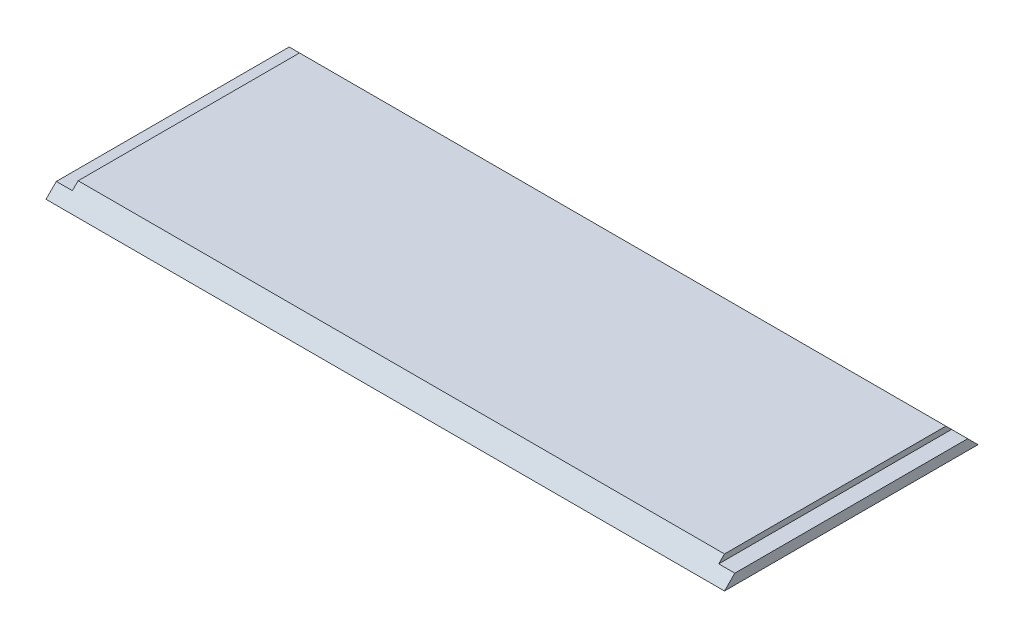
ISO-10303-21;
HEADER;
FILE_DESCRIPTION(('STEP AP214'),'2;1');
FILE_NAME('part.step','',(''),(''),'','','');
FILE_SCHEMA(('AUTOMOTIVE_DESIGN { 1 0 10303 214 1 1 1 1 }'));
ENDSEC;
DATA;
#1=APPLICATION_CONTEXT('core data for automotive mechanical design processes');
#2=APPLICATION_PROTOCOL_DEFINITION('international standard','automotive_design',2000,#1);
#3=PRODUCT_CONTEXT('',#1,'mechanical');
#4=PRODUCT('Part','Part','',(#3));
#5=PRODUCT_RELATED_PRODUCT_CATEGORY('part','',(#4));
#6=PRODUCT_DEFINITION_FORMATION('','',#4);
#7=PRODUCT_DEFINITION_CONTEXT('part definition',#1,'design');
#8=PRODUCT_DEFINITION('design','',#6,#7);
#9=PRODUCT_DEFINITION_SHAPE('','',#8);
#10=(LENGTH_UNIT() NAMED_UNIT(*) SI_UNIT(.MILLI.,.METRE.));
#11=(NAMED_UNIT(*) PLANE_ANGLE_UNIT() SI_UNIT($,.RADIAN.));
#12=(NAMED_UNIT(*) SI_UNIT($,.STERADIAN.) SOLID_ANGLE_UNIT());
#13=UNCERTAINTY_MEASURE_WITH_UNIT(LENGTH_MEASURE(1.E-05),#10,'distance_accuracy_value','');
#14=(GEOMETRIC_REPRESENTATION_CONTEXT(3) GLOBAL_UNCERTAINTY_ASSIGNED_CONTEXT((#13)) GLOBAL_UNIT_ASSIGNED_CONTEXT((#10,
#11,#12)) REPRESENTATION_CONTEXT('',''));
#15=CARTESIAN_POINT('',(0.,0.,0.));
#16=DIRECTION('',(0.,0.,1.));
#17=DIRECTION('',(1.,0.,0.));
#18=AXIS2_PLACEMENT_3D('',#15,#16,#17);
#19=CARTESIAN_POINT('',(-45.1742243436754,2.8,-28.0927207637231));
#20=DIRECTION('',(1.,0.,0.));
#21=DIRECTION('',(0.,0.,-1.));
#22=AXIS2_PLACEMENT_3D('',#19,#20,#21);
#23=PLANE('',#22);
#24=DIRECTION('',(0.,0.,1.));
#25=VECTOR('',#24,1.);
#26=CARTESIAN_POINT('',(-45.1742243436754,0.,-28.0927207637231));
#27=LINE('',#26,#25);
#28=CARTESIAN_POINT('',(-45.1742243436754,0.,-28.0927207637231));
#29=VERTEX_POINT('',#28);
#30=CARTESIAN_POINT('',(-45.1742243436754,0.,16.1072792362769));
#31=VERTEX_POINT('',#30);
#32=EDGE_CURVE('E106',#29,#31,#27,.T.);
#33=ORIENTED_EDGE('',*,*,#32,.T.);
#34=DIRECTION('',(0.,-0.707106781186551,0.707106781186544));
#35=VECTOR('',#34,1.);
#36=CARTESIAN_POINT('',(-45.1742243436754,2.8,13.307279236277));
#37=LINE('',#36,#35);
#38=CARTESIAN_POINT('',(-45.1742243436754,1.8,14.307279236277));
#39=VERTEX_POINT('',#38);
#40=EDGE_CURVE('E100',#39,#31,#37,.T.);
#41=ORIENTED_EDGE('',*,*,#40,.F.);
#42=DIRECTION('',(0.,0.,1.));
#43=VECTOR('',#42,1.);
#44=CARTESIAN_POINT('',(-45.1742243436754,1.8,-28.0927207637231));
#45=LINE('',#44,#43);
#46=CARTESIAN_POINT('',(-45.1742243436754,1.8,-26.2927207637231));
#47=VERTEX_POINT('',#46);
#48=EDGE_CURVE('E135',#47,#39,#45,.T.);
#49=ORIENTED_EDGE('',*,*,#48,.F.);
#50=DIRECTION('',(0.,0.707106781186551,0.707106781186544));
#51=VECTOR('',#50,1.);
#52=CARTESIAN_POINT('',(-45.1742243436754,2.8,-25.2927207637231));
#53=LINE('',#52,#51);
#54=EDGE_CURVE('E149',#29,#47,#53,.T.);
#55=ORIENTED_EDGE('',*,*,#54,.F.);
#56=EDGE_LOOP('',(#33,#41,#49,#55));
#57=FACE_BOUND('',#56,.T.);
#58=ADVANCED_FACE('F35',(#57),#23,.F.);
#59=CARTESIAN_POINT('',(73.1257756563246,2.8,-28.0927207637231));
#60=DIRECTION('',(-1.,0.,0.));
#61=DIRECTION('',(0.,0.,1.));
#62=AXIS2_PLACEMENT_3D('',#59,#60,#61);
#63=PLANE('',#62);
#64=DIRECTION('',(0.,0.,-1.));
#65=VECTOR('',#64,1.);
#66=CARTESIAN_POINT('',(73.1257756563246,1.8,-28.0927207637231));
#67=LINE('',#66,#65);
#68=CARTESIAN_POINT('',(73.1257756563246,1.8,14.307279236277));
#69=VERTEX_POINT('',#68);
#70=CARTESIAN_POINT('',(73.1257756563246,1.8,-26.2927207637231));
#71=VERTEX_POINT('',#70);
#72=EDGE_CURVE('E114',#69,#71,#67,.T.);
#73=ORIENTED_EDGE('',*,*,#72,.F.);
#74=DIRECTION('',(0.,-0.707106781186551,0.707106781186544));
#75=VECTOR('',#74,1.);
#76=CARTESIAN_POINT('',(73.1257756563246,2.8,13.307279236277));
#77=LINE('',#76,#75);
#78=CARTESIAN_POINT('',(73.1257756563246,0.,16.1072792362769));
#79=VERTEX_POINT('',#78);
#80=EDGE_CURVE('E49',#69,#79,#77,.T.);
#81=ORIENTED_EDGE('',*,*,#80,.T.);
#82=DIRECTION('',(0.,0.,-1.));
#83=VECTOR('',#82,1.);
#84=CARTESIAN_POINT('',(73.1257756563246,0.,-28.0927207637231));
#85=LINE('',#84,#83);
#86=CARTESIAN_POINT('',(73.1257756563246,0.,-28.0927207637231));
#87=VERTEX_POINT('',#86);
#88=EDGE_CURVE('E105',#79,#87,#85,.T.);
#89=ORIENTED_EDGE('',*,*,#88,.T.);
#90=DIRECTION('',(0.,0.707106781186551,0.707106781186544));
#91=VECTOR('',#90,1.);
#92=CARTESIAN_POINT('',(73.1257756563246,2.8,-25.2927207637231));
#93=LINE('',#92,#91);
#94=EDGE_CURVE('E152',#87,#71,#93,.T.);
#95=ORIENTED_EDGE('',*,*,#94,.T.);
#96=EDGE_LOOP('',(#73,#81,#89,#95));
#97=FACE_BOUND('',#96,.T.);
#98=ADVANCED_FACE('F111',(#97),#63,.F.);
#99=CARTESIAN_POINT('',(0.,2.8,0.));
#100=DIRECTION('',(0.,1.,0.));
#101=DIRECTION('',(0.,0.,1.));
#102=AXIS2_PLACEMENT_3D('',#99,#100,#101);
#103=PLANE('',#102);
#104=DIRECTION('',(-1.,0.,0.));
#105=VECTOR('',#104,1.);
#106=CARTESIAN_POINT('',(73.1257756563246,2.8,13.307279236277));
#107=LINE('',#106,#105);
#108=CARTESIAN_POINT('',(70.3257756563246,2.8,13.307279236277));
#109=VERTEX_POINT('',#108);
#110=CARTESIAN_POINT('',(-42.3742243436754,2.8,13.307279236277));
#111=VERTEX_POINT('',#110);
#112=EDGE_CURVE('E115',#109,#111,#107,.T.);
#113=ORIENTED_EDGE('',*,*,#112,.F.);
#114=DIRECTION('',(0.,0.,1.));
#115=VECTOR('',#114,1.);
#116=CARTESIAN_POINT('',(70.3257756563246,2.8,-28.0927207637231));
#117=LINE('',#116,#115);
#118=CARTESIAN_POINT('',(70.3257756563246,2.8,-25.2927207637231));
#119=VERTEX_POINT('',#118);
#120=EDGE_CURVE('E137',#119,#109,#117,.T.);
#121=ORIENTED_EDGE('',*,*,#120,.F.);
#122=DIRECTION('',(-1.,0.,0.));
#123=VECTOR('',#122,1.);
#124=CARTESIAN_POINT('',(73.1257756563246,2.8,-25.2927207637231));
#125=LINE('',#124,#123);
#126=CARTESIAN_POINT('',(-42.3742243436754,2.8,-25.2927207637231));
#127=VERTEX_POINT('',#126);
#128=EDGE_CURVE('E155',#119,#127,#125,.T.);
#129=ORIENTED_EDGE('',*,*,#128,.T.);
#130=DIRECTION('',(0.,0.,-1.));
#131=VECTOR('',#130,1.);
#132=CARTESIAN_POINT('',(-42.3742243436754,2.8,-28.0927207637231));
#133=LINE('',#132,#131);
#134=EDGE_CURVE('E133',#111,#127,#133,.T.);
#135=ORIENTED_EDGE('',*,*,#134,.F.);
#136=EDGE_LOOP('',(#113,#121,#129,#135));
#137=FACE_BOUND('',#136,.T.);
#138=ADVANCED_FACE('F174',(#137),#103,.T.);
#139=CARTESIAN_POINT('',(0.,0.,0.));
#140=DIRECTION('',(0.,1.,0.));
#141=DIRECTION('',(0.,0.,1.));
#142=AXIS2_PLACEMENT_3D('',#139,#140,#141);
#143=PLANE('',#142);
#144=ORIENTED_EDGE('',*,*,#32,.F.);
#145=DIRECTION('',(-1.,0.,0.));
#146=VECTOR('',#145,1.);
#147=CARTESIAN_POINT('',(-45.1742243436754,0.,-28.0927207637231));
#148=LINE('',#147,#146);
#149=EDGE_CURVE('E118',#87,#29,#148,.T.);
#150=ORIENTED_EDGE('',*,*,#149,.F.);
#151=ORIENTED_EDGE('',*,*,#88,.F.);
#152=DIRECTION('',(1.,0.,0.));
#153=VECTOR('',#152,1.);
#154=CARTESIAN_POINT('',(-45.1742243436754,0.,16.1072792362769));
#155=LINE('',#154,#153);
#156=EDGE_CURVE('E97',#31,#79,#155,.T.);
#157=ORIENTED_EDGE('',*,*,#156,.F.);
#158=EDGE_LOOP('',(#144,#150,#151,#157));
#159=FACE_BOUND('',#158,.T.);
#160=ADVANCED_FACE('F117',(#159),#143,.F.);
#161=CARTESIAN_POINT('',(-42.3742243436754,1.8,-28.0927207637231));
#162=DIRECTION('',(1.,0.,0.));
#163=DIRECTION('',(0.,0.,-1.));
#164=AXIS2_PLACEMENT_3D('',#161,#162,#163);
#165=PLANE('',#164);
#166=DIRECTION('',(0.,0.,-1.));
#167=VECTOR('',#166,1.);
#168=CARTESIAN_POINT('',(-42.3742243436754,1.8,-28.0927207637231));
#169=LINE('',#168,#167);
#170=CARTESIAN_POINT('',(-42.3742243436754,1.8,14.307279236277));
#171=VERTEX_POINT('',#170);
#172=CARTESIAN_POINT('',(-42.3742243436754,1.8,-26.2927207637231));
#173=VERTEX_POINT('',#172);
#174=EDGE_CURVE('E145',#171,#173,#169,.T.);
#175=ORIENTED_EDGE('',*,*,#174,.F.);
#176=DIRECTION('',(0.,0.707106781186551,-0.707106781186544));
#177=VECTOR('',#176,1.);
#178=CARTESIAN_POINT('',(-42.3742243436754,23.,-6.89272076372285));
#179=LINE('',#178,#177);
#180=EDGE_CURVE('E153',#171,#111,#179,.T.);
#181=ORIENTED_EDGE('',*,*,#180,.T.);
#182=ORIENTED_EDGE('',*,*,#134,.T.);
#183=DIRECTION('',(0.,-0.707106781186551,-0.707106781186544));
#184=VECTOR('',#183,1.);
#185=CARTESIAN_POINT('',(-42.3742243436754,0.900000000000009,-27.1927207637231));
#186=LINE('',#185,#184);
#187=EDGE_CURVE('E142',#127,#173,#186,.T.);
#188=ORIENTED_EDGE('',*,*,#187,.T.);
#189=EDGE_LOOP('',(#175,#181,#182,#188));
#190=FACE_BOUND('',#189,.T.);
#191=ADVANCED_FACE('F169',(#190),#165,.F.);
#192=CARTESIAN_POINT('',(0.,1.8,0.));
#193=DIRECTION('',(0.,1.,0.));
#194=DIRECTION('',(0.,0.,1.));
#195=AXIS2_PLACEMENT_3D('',#192,#193,#194);
#196=PLANE('',#195);
#197=DIRECTION('',(-1.,0.,0.));
#198=VECTOR('',#197,1.);
#199=CARTESIAN_POINT('',(0.,1.8,14.307279236277));
#200=LINE('',#199,#198);
#201=EDGE_CURVE('E158',#171,#39,#200,.T.);
#202=ORIENTED_EDGE('',*,*,#201,.F.);
#203=ORIENTED_EDGE('',*,*,#174,.T.);
#204=DIRECTION('',(1.,0.,0.));
#205=VECTOR('',#204,1.);
#206=CARTESIAN_POINT('',(0.,1.8,-26.2927207637231));
#207=LINE('',#206,#205);
#208=EDGE_CURVE('E164',#47,#173,#207,.T.);
#209=ORIENTED_EDGE('',*,*,#208,.F.);
#210=ORIENTED_EDGE('',*,*,#48,.T.);
#211=EDGE_LOOP('',(#202,#203,#209,#210));
#212=FACE_BOUND('',#211,.T.);
#213=ADVANCED_FACE('F181',(#212),#196,.T.);
#214=CARTESIAN_POINT('',(70.3257756563246,1.8,-28.0927207637231));
#215=DIRECTION('',(-1.,0.,0.));
#216=DIRECTION('',(0.,0.,1.));
#217=AXIS2_PLACEMENT_3D('',#214,#215,#216);
#218=PLANE('',#217);
#219=ORIENTED_EDGE('',*,*,#120,.T.);
#220=DIRECTION('',(0.,-0.707106781186551,0.707106781186544));
#221=VECTOR('',#220,1.);
#222=CARTESIAN_POINT('',(70.3257756563246,23.,-6.89272076372285));
#223=LINE('',#222,#221);
#224=CARTESIAN_POINT('',(70.3257756563246,1.8,14.307279236277));
#225=VERTEX_POINT('',#224);
#226=EDGE_CURVE('E132',#109,#225,#223,.T.);
#227=ORIENTED_EDGE('',*,*,#226,.T.);
#228=DIRECTION('',(0.,0.,1.));
#229=VECTOR('',#228,1.);
#230=CARTESIAN_POINT('',(70.3257756563246,1.8,-28.0927207637231));
#231=LINE('',#230,#229);
#232=CARTESIAN_POINT('',(70.3257756563246,1.8,-26.2927207637231));
#233=VERTEX_POINT('',#232);
#234=EDGE_CURVE('E126',#233,#225,#231,.T.);
#235=ORIENTED_EDGE('',*,*,#234,.F.);
#236=DIRECTION('',(0.,0.707106781186551,0.707106781186544));
#237=VECTOR('',#236,1.);
#238=CARTESIAN_POINT('',(70.3257756563246,0.900000000000009,-27.1927207637231));
#239=LINE('',#238,#237);
#240=EDGE_CURVE('E56',#233,#119,#239,.T.);
#241=ORIENTED_EDGE('',*,*,#240,.T.);
#242=EDGE_LOOP('',(#219,#227,#235,#241));
#243=FACE_BOUND('',#242,.T.);
#244=ADVANCED_FACE('F130',(#243),#218,.F.);
#245=CARTESIAN_POINT('',(0.,1.8,0.));
#246=DIRECTION('',(0.,-1.,0.));
#247=DIRECTION('',(0.,0.,-1.));
#248=AXIS2_PLACEMENT_3D('',#245,#246,#247);
#249=PLANE('',#248);
#250=ORIENTED_EDGE('',*,*,#234,.T.);
#251=DIRECTION('',(1.,0.,0.));
#252=VECTOR('',#251,1.);
#253=CARTESIAN_POINT('',(0.,1.8,14.307279236277));
#254=LINE('',#253,#252);
#255=EDGE_CURVE('E11',#225,#69,#254,.T.);
#256=ORIENTED_EDGE('',*,*,#255,.T.);
#257=ORIENTED_EDGE('',*,*,#72,.T.);
#258=DIRECTION('',(-1.,0.,0.));
#259=VECTOR('',#258,1.);
#260=CARTESIAN_POINT('',(0.,1.8,-26.2927207637231));
#261=LINE('',#260,#259);
#262=EDGE_CURVE('E42',#71,#233,#261,.T.);
#263=ORIENTED_EDGE('',*,*,#262,.T.);
#264=EDGE_LOOP('',(#250,#256,#257,#263));
#265=FACE_BOUND('',#264,.T.);
#266=ADVANCED_FACE('F125',(#265),#249,.F.);
#267=CARTESIAN_POINT('',(73.1257756563246,2.8,-25.2927207637231));
#268=DIRECTION('',(0.,-0.707106781186544,0.707106781186551));
#269=DIRECTION('',(0.,-0.707106781186551,-0.707106781186544));
#270=AXIS2_PLACEMENT_3D('',#267,#268,#269);
#271=PLANE('',#270);
#272=ORIENTED_EDGE('',*,*,#128,.F.);
#273=ORIENTED_EDGE('',*,*,#240,.F.);
#274=ORIENTED_EDGE('',*,*,#262,.F.);
#275=ORIENTED_EDGE('',*,*,#94,.F.);
#276=ORIENTED_EDGE('',*,*,#149,.T.);
#277=ORIENTED_EDGE('',*,*,#54,.T.);
#278=ORIENTED_EDGE('',*,*,#208,.T.);
#279=ORIENTED_EDGE('',*,*,#187,.F.);
#280=EDGE_LOOP('',(#272,#273,#274,#275,#276,#277,#278,#279));
#281=FACE_BOUND('',#280,.T.);
#282=ADVANCED_FACE('F171',(#281),#271,.F.);
#283=CARTESIAN_POINT('',(73.1257756563246,2.8,13.307279236277));
#284=DIRECTION('',(0.,-0.707106781186544,-0.707106781186551));
#285=DIRECTION('',(0.,0.707106781186551,-0.707106781186544));
#286=AXIS2_PLACEMENT_3D('',#283,#284,#285);
#287=PLANE('',#286);
#288=ORIENTED_EDGE('',*,*,#201,.T.);
#289=ORIENTED_EDGE('',*,*,#40,.T.);
#290=ORIENTED_EDGE('',*,*,#156,.T.);
#291=ORIENTED_EDGE('',*,*,#80,.F.);
#292=ORIENTED_EDGE('',*,*,#255,.F.);
#293=ORIENTED_EDGE('',*,*,#226,.F.);
#294=ORIENTED_EDGE('',*,*,#112,.T.);
#295=ORIENTED_EDGE('',*,*,#180,.F.);
#296=EDGE_LOOP('',(#288,#289,#290,#291,#292,#293,#294,#295));
#297=FACE_BOUND('',#296,.T.);
#298=ADVANCED_FACE('F98',(#297),#287,.F.);
#299=CLOSED_SHELL('',(#58,#98,#138,#160,#191,#213,#244,#266,#282,#298));
#300=MANIFOLD_SOLID_BREP('B2',#299);
#301=ADVANCED_BREP_SHAPE_REPRESENTATION('',(#18,#300),#14);
#302=SHAPE_DEFINITION_REPRESENTATION(#9,#301);
ENDSEC;
END-ISO-10303-21;
